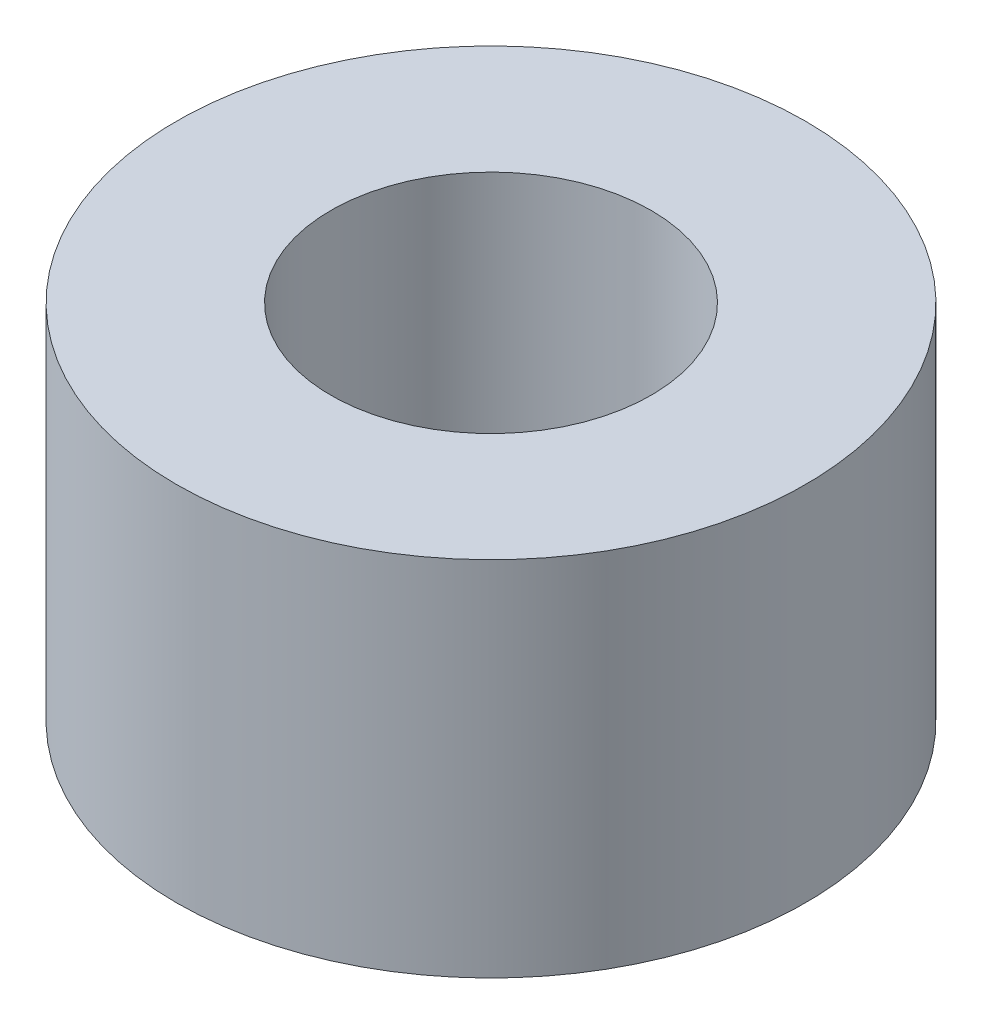
ISO-10303-21;
HEADER;
FILE_DESCRIPTION(('STEP AP214'),'2;1');
FILE_NAME('part.step','',(''),(''),'','','');
FILE_SCHEMA(('AUTOMOTIVE_DESIGN { 1 0 10303 214 1 1 1 1 }'));
ENDSEC;
DATA;
#1=APPLICATION_CONTEXT('core data for automotive mechanical design processes');
#2=APPLICATION_PROTOCOL_DEFINITION('international standard','automotive_design',2000,#1);
#3=PRODUCT_CONTEXT('',#1,'mechanical');
#4=PRODUCT('Part','Part','',(#3));
#5=PRODUCT_RELATED_PRODUCT_CATEGORY('part','',(#4));
#6=PRODUCT_DEFINITION_FORMATION('','',#4);
#7=PRODUCT_DEFINITION_CONTEXT('part definition',#1,'design');
#8=PRODUCT_DEFINITION('design','',#6,#7);
#9=PRODUCT_DEFINITION_SHAPE('','',#8);
#10=(LENGTH_UNIT() NAMED_UNIT(*) SI_UNIT(.MILLI.,.METRE.));
#11=(NAMED_UNIT(*) PLANE_ANGLE_UNIT() SI_UNIT($,.RADIAN.));
#12=(NAMED_UNIT(*) SI_UNIT($,.STERADIAN.) SOLID_ANGLE_UNIT());
#13=UNCERTAINTY_MEASURE_WITH_UNIT(LENGTH_MEASURE(1.E-05),#10,'distance_accuracy_value','');
#14=(GEOMETRIC_REPRESENTATION_CONTEXT(3) GLOBAL_UNCERTAINTY_ASSIGNED_CONTEXT((#13)) GLOBAL_UNIT_ASSIGNED_CONTEXT((#10,
#11,#12)) REPRESENTATION_CONTEXT('',''));
#15=CARTESIAN_POINT('',(0.,0.,0.));
#16=DIRECTION('',(0.,0.,1.));
#17=DIRECTION('',(1.,0.,0.));
#18=AXIS2_PLACEMENT_3D('',#15,#16,#17);
#19=CARTESIAN_POINT('',(0.,4.826,0.));
#20=DIRECTION('',(0.,-1.,0.));
#21=DIRECTION('',(0.,0.,-1.));
#22=AXIS2_PLACEMENT_3D('',#19,#20,#21);
#23=CYLINDRICAL_SURFACE('',#22,2.1336);
#24=CARTESIAN_POINT('',(0.,0.,0.));
#25=DIRECTION('',(0.,-1.,0.));
#26=DIRECTION('',(0.,0.,-1.));
#27=AXIS2_PLACEMENT_3D('',#24,#25,#26);
#28=CIRCLE('',#27,2.1336);
#29=CARTESIAN_POINT('',(0.,0.,-2.1336));
#30=VERTEX_POINT('',#29);
#31=EDGE_CURVE('E28',#30,#30,#28,.T.);
#32=ORIENTED_EDGE('',*,*,#31,.T.);
#33=EDGE_LOOP('',(#32));
#34=FACE_BOUND('',#33,.T.);
#35=CARTESIAN_POINT('',(0.,4.826,0.));
#36=DIRECTION('',(0.,-1.,0.));
#37=DIRECTION('',(0.,0.,-1.));
#38=AXIS2_PLACEMENT_3D('',#35,#36,#37);
#39=CIRCLE('',#38,2.1336);
#40=CARTESIAN_POINT('',(0.,4.826,-2.1336));
#41=VERTEX_POINT('',#40);
#42=EDGE_CURVE('E19',#41,#41,#39,.T.);
#43=ORIENTED_EDGE('',*,*,#42,.F.);
#44=EDGE_LOOP('',(#43));
#45=FACE_BOUND('',#44,.T.);
#46=ADVANCED_FACE('F16',(#34,#45),#23,.F.);
#47=CARTESIAN_POINT('',(0.,4.826,0.));
#48=DIRECTION('',(0.,1.,0.));
#49=DIRECTION('',(0.,0.,1.));
#50=AXIS2_PLACEMENT_3D('',#47,#48,#49);
#51=PLANE('',#50);
#52=ORIENTED_EDGE('',*,*,#42,.T.);
#53=EDGE_LOOP('',(#52));
#54=FACE_BOUND('',#53,.T.);
#55=CARTESIAN_POINT('',(0.,4.826,0.));
#56=DIRECTION('',(0.,-1.,0.));
#57=DIRECTION('',(0.,0.,-1.));
#58=AXIS2_PLACEMENT_3D('',#55,#56,#57);
#59=CIRCLE('',#58,4.191);
#60=CARTESIAN_POINT('',(0.,4.826,-4.191));
#61=VERTEX_POINT('',#60);
#62=EDGE_CURVE('E23',#61,#61,#59,.T.);
#63=ORIENTED_EDGE('',*,*,#62,.F.);
#64=EDGE_LOOP('',(#63));
#65=FACE_BOUND('',#64,.T.);
#66=ADVANCED_FACE('F36',(#54,#65),#51,.T.);
#67=CARTESIAN_POINT('',(0.,0.,0.));
#68=DIRECTION('',(0.,1.,0.));
#69=DIRECTION('',(0.,0.,1.));
#70=AXIS2_PLACEMENT_3D('',#67,#68,#69);
#71=PLANE('',#70);
#72=ORIENTED_EDGE('',*,*,#31,.F.);
#73=EDGE_LOOP('',(#72));
#74=FACE_BOUND('',#73,.T.);
#75=CARTESIAN_POINT('',(0.,0.,0.));
#76=DIRECTION('',(0.,-1.,0.));
#77=DIRECTION('',(0.,0.,-1.));
#78=AXIS2_PLACEMENT_3D('',#75,#76,#77);
#79=CIRCLE('',#78,4.191);
#80=CARTESIAN_POINT('',(0.,0.,-4.191));
#81=VERTEX_POINT('',#80);
#82=EDGE_CURVE('E10',#81,#81,#79,.F.);
#83=ORIENTED_EDGE('',*,*,#82,.F.);
#84=EDGE_LOOP('',(#83));
#85=FACE_BOUND('',#84,.T.);
#86=ADVANCED_FACE('F43',(#74,#85),#71,.F.);
#87=CARTESIAN_POINT('',(0.,4.826,0.));
#88=DIRECTION('',(0.,-1.,0.));
#89=DIRECTION('',(0.,0.,-1.));
#90=AXIS2_PLACEMENT_3D('',#87,#88,#89);
#91=CYLINDRICAL_SURFACE('',#90,4.191);
#92=ORIENTED_EDGE('',*,*,#82,.T.);
#93=EDGE_LOOP('',(#92));
#94=FACE_BOUND('',#93,.T.);
#95=ORIENTED_EDGE('',*,*,#62,.T.);
#96=EDGE_LOOP('',(#95));
#97=FACE_BOUND('',#96,.T.);
#98=ADVANCED_FACE('F44',(#94,#97),#91,.T.);
#99=CLOSED_SHELL('',(#46,#66,#86,#98));
#100=MANIFOLD_SOLID_BREP('B1',#99);
#101=ADVANCED_BREP_SHAPE_REPRESENTATION('',(#18,#100),#14);
#102=SHAPE_DEFINITION_REPRESENTATION(#9,#101);
ENDSEC;
END-ISO-10303-21;
